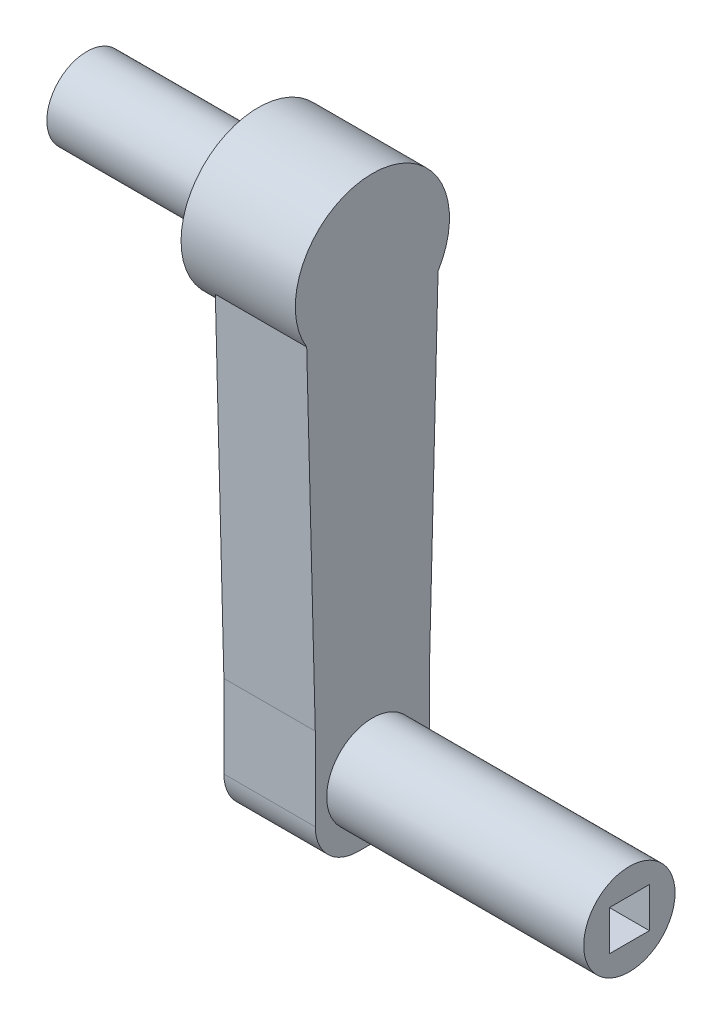
ISO-10303-21;
HEADER;
FILE_DESCRIPTION(('STEP AP214'),'2;1');
FILE_NAME('part.step','',(''),(''),'','','');
FILE_SCHEMA(('AUTOMOTIVE_DESIGN { 1 0 10303 214 1 1 1 1 }'));
ENDSEC;
DATA;
#1=APPLICATION_CONTEXT('core data for automotive mechanical design processes');
#2=APPLICATION_PROTOCOL_DEFINITION('international standard','automotive_design',2000,#1);
#3=PRODUCT_CONTEXT('',#1,'mechanical');
#4=PRODUCT('Part','Part','',(#3));
#5=PRODUCT_RELATED_PRODUCT_CATEGORY('part','',(#4));
#6=PRODUCT_DEFINITION_FORMATION('','',#4);
#7=PRODUCT_DEFINITION_CONTEXT('part definition',#1,'design');
#8=PRODUCT_DEFINITION('design','',#6,#7);
#9=PRODUCT_DEFINITION_SHAPE('','',#8);
#10=(LENGTH_UNIT() NAMED_UNIT(*) SI_UNIT(.MILLI.,.METRE.));
#11=(NAMED_UNIT(*) PLANE_ANGLE_UNIT() SI_UNIT($,.RADIAN.));
#12=(NAMED_UNIT(*) SI_UNIT($,.STERADIAN.) SOLID_ANGLE_UNIT());
#13=UNCERTAINTY_MEASURE_WITH_UNIT(LENGTH_MEASURE(1.E-05),#10,'distance_accuracy_value','');
#14=(GEOMETRIC_REPRESENTATION_CONTEXT(3) GLOBAL_UNCERTAINTY_ASSIGNED_CONTEXT((#13)) GLOBAL_UNIT_ASSIGNED_CONTEXT((#10,
#11,#12)) REPRESENTATION_CONTEXT('',''));
#15=CARTESIAN_POINT('',(0.,0.,0.));
#16=DIRECTION('',(0.,0.,1.));
#17=DIRECTION('',(1.,0.,0.));
#18=AXIS2_PLACEMENT_3D('',#15,#16,#17);
#19=CARTESIAN_POINT('',(-300.,0.,0.));
#20=DIRECTION('',(1.,0.,0.));
#21=DIRECTION('',(0.,0.,-1.));
#22=AXIS2_PLACEMENT_3D('',#19,#20,#21);
#23=CYLINDRICAL_SURFACE('',#22,70.);
#24=CARTESIAN_POINT('',(-300.,0.,0.));
#25=DIRECTION('',(1.,0.,0.));
#26=DIRECTION('',(0.,0.,-1.));
#27=AXIS2_PLACEMENT_3D('',#24,#25,#26);
#28=CIRCLE('',#27,70.);
#29=CARTESIAN_POINT('',(-300.,0.,-70.));
#30=VERTEX_POINT('',#29);
#31=EDGE_CURVE('E12',#30,#30,#28,.T.);
#32=ORIENTED_EDGE('',*,*,#31,.T.);
#33=EDGE_LOOP('',(#32));
#34=FACE_BOUND('',#33,.T.);
#35=CARTESIAN_POINT('',(0.,0.,0.));
#36=DIRECTION('',(1.,0.,0.));
#37=DIRECTION('',(0.,0.,-1.));
#38=AXIS2_PLACEMENT_3D('',#35,#36,#37);
#39=CIRCLE('',#38,70.);
#40=CARTESIAN_POINT('',(0.,0.,-70.));
#41=VERTEX_POINT('',#40);
#42=EDGE_CURVE('E85',#41,#41,#39,.T.);
#43=ORIENTED_EDGE('',*,*,#42,.F.);
#44=EDGE_LOOP('',(#43));
#45=FACE_BOUND('',#44,.T.);
#46=ADVANCED_FACE('F78',(#34,#45),#23,.T.);
#47=CARTESIAN_POINT('',(-300.,0.,0.));
#48=DIRECTION('',(1.,0.,0.));
#49=DIRECTION('',(0.,0.,-1.));
#50=AXIS2_PLACEMENT_3D('',#47,#48,#49);
#51=PLANE('',#50);
#52=ORIENTED_EDGE('',*,*,#31,.F.);
#53=EDGE_LOOP('',(#52));
#54=FACE_BOUND('',#53,.T.);
#55=ADVANCED_FACE('F91',(#54),#51,.F.);
#56=CARTESIAN_POINT('',(0.,0.,0.));
#57=DIRECTION('',(1.,0.,0.));
#58=DIRECTION('',(0.,0.,-1.));
#59=AXIS2_PLACEMENT_3D('',#56,#57,#58);
#60=PLANE('',#59);
#61=ORIENTED_EDGE('',*,*,#42,.T.);
#62=EDGE_LOOP('',(#61));
#63=FACE_BOUND('',#62,.T.);
#64=ADVANCED_FACE('F94',(#63),#60,.T.);
#65=CLOSED_SHELL('',(#46,#55,#64));
#66=MANIFOLD_SOLID_BREP('B2',#65);
#67=CARTESIAN_POINT('',(200.,-2.96751568959073,-116.722283790569));
#68=DIRECTION('',(0.,0.0254155162777915,0.999676973593137));
#69=DIRECTION('',(0.,-0.999676973593137,0.0254155162777915));
#70=AXIS2_PLACEMENT_3D('',#67,#68,#69);
#71=PLANE('',#70);
#72=DIRECTION('',(-1.,0.,0.));
#73=VECTOR('',#72,1.);
#74=CARTESIAN_POINT('',(200.,-660.710678118656,-100.));
#75=LINE('',#74,#73);
#76=CARTESIAN_POINT('',(200.,-660.710678118656,-100.));
#77=VERTEX_POINT('',#76);
#78=CARTESIAN_POINT('',(40.0000000000001,-660.710678118656,-100.));
#79=VERTEX_POINT('',#78);
#80=EDGE_CURVE('E327',#77,#79,#75,.T.);
#81=ORIENTED_EDGE('',*,*,#80,.T.);
#82=DIRECTION('',(0.,0.999676973593137,-0.0254155162777915));
#83=VECTOR('',#82,1.);
#84=CARTESIAN_POINT('',(40.,-2.96751568959073,-116.722283790569));
#85=LINE('',#84,#83);
#86=CARTESIAN_POINT('',(40.,-70.7106781186548,-115.));
#87=VERTEX_POINT('',#86);
#88=EDGE_CURVE('E350',#79,#87,#85,.T.);
#89=ORIENTED_EDGE('',*,*,#88,.T.);
#90=DIRECTION('',(-1.,0.,0.));
#91=VECTOR('',#90,1.);
#92=CARTESIAN_POINT('',(200.,-70.7106781186548,-115.));
#93=LINE('',#92,#91);
#94=CARTESIAN_POINT('',(200.,-70.7106781186548,-115.));
#95=VERTEX_POINT('',#94);
#96=EDGE_CURVE('E325',#95,#87,#93,.T.);
#97=ORIENTED_EDGE('',*,*,#96,.F.);
#98=DIRECTION('',(0.,0.999676973593137,-0.0254155162777915));
#99=VECTOR('',#98,1.);
#100=CARTESIAN_POINT('',(200.,-2.96751568959073,-116.722283790569));
#101=LINE('',#100,#99);
#102=EDGE_CURVE('E289',#77,#95,#101,.T.);
#103=ORIENTED_EDGE('',*,*,#102,.F.);
#104=EDGE_LOOP('',(#81,#89,#97,#103));
#105=FACE_BOUND('',#104,.T.);
#106=ADVANCED_FACE('F122',(#105),#71,.F.);
#107=CARTESIAN_POINT('',(200.,0.,0.));
#108=DIRECTION('',(-1.,0.,0.));
#109=DIRECTION('',(0.,0.,1.));
#110=AXIS2_PLACEMENT_3D('',#107,#108,#109);
#111=CYLINDRICAL_SURFACE('',#110,135.);
#112=CARTESIAN_POINT('',(0.,0.,0.));
#113=DIRECTION('',(1.,0.,0.));
#114=DIRECTION('',(0.,0.,-1.));
#115=AXIS2_PLACEMENT_3D('',#112,#113,#114);
#116=CIRCLE('',#115,135.);
#117=CARTESIAN_POINT('',(0.,-112.968623020499,-73.9127202371316));
#118=VERTEX_POINT('',#117);
#119=CARTESIAN_POINT('',(0.,-112.968623020499,73.9127202371314));
#120=VERTEX_POINT('',#119);
#121=EDGE_CURVE('E283',#118,#120,#116,.T.);
#122=ORIENTED_EDGE('',*,*,#121,.T.);
#123=CARTESIAN_POINT('',(-76.760000353949,0.,0.));
#124=DIRECTION('',(0.707106781186548,0.0179714839073836,-0.706878367023752));
#125=DIRECTION('',(-0.707106781186548,0.0179714839073836,-0.706878367023752));
#126=AXIS2_PLACEMENT_3D('',#123,#124,#125);
#127=ELLIPSE('',#126,190.918830920368,135.);
#128=CARTESIAN_POINT('',(40.0000000000001,-70.7106781186548,115.));
#129=VERTEX_POINT('',#128);
#130=EDGE_CURVE('E132',#120,#129,#127,.F.);
#131=ORIENTED_EDGE('',*,*,#130,.T.);
#132=DIRECTION('',(-1.,0.,0.));
#133=VECTOR('',#132,1.);
#134=CARTESIAN_POINT('',(200.,-70.7106781186548,115.));
#135=LINE('',#134,#133);
#136=CARTESIAN_POINT('',(200.,-70.7106781186548,115.));
#137=VERTEX_POINT('',#136);
#138=EDGE_CURVE('E318',#137,#129,#135,.T.);
#139=ORIENTED_EDGE('',*,*,#138,.F.);
#140=CARTESIAN_POINT('',(200.,0.,0.));
#141=DIRECTION('',(1.,0.,0.));
#142=DIRECTION('',(0.,0.,-1.));
#143=AXIS2_PLACEMENT_3D('',#140,#141,#142);
#144=CIRCLE('',#143,135.);
#145=EDGE_CURVE('E290',#95,#137,#144,.T.);
#146=ORIENTED_EDGE('',*,*,#145,.F.);
#147=ORIENTED_EDGE('',*,*,#96,.T.);
#148=CARTESIAN_POINT('',(-76.760000353949,0.,0.));
#149=DIRECTION('',(0.707106781186548,0.0179714839073834,0.706878367023752));
#150=DIRECTION('',(-0.707106781186547,0.0179714839073834,0.706878367023753));
#151=AXIS2_PLACEMENT_3D('',#148,#149,#150);
#152=ELLIPSE('',#151,190.918830920368,135.);
#153=EDGE_CURVE('E76',#87,#118,#152,.F.);
#154=ORIENTED_EDGE('',*,*,#153,.T.);
#155=EDGE_LOOP('',(#122,#131,#139,#146,#147,#154));
#156=FACE_BOUND('',#155,.T.);
#157=ADVANCED_FACE('F388',(#156),#111,.T.);
#158=CARTESIAN_POINT('',(200.,-2.96751568959076,116.722283790569));
#159=DIRECTION('',(0.,0.0254155162777917,-0.999676973593137));
#160=DIRECTION('',(0.,0.999676973593137,0.0254155162777917));
#161=AXIS2_PLACEMENT_3D('',#158,#159,#160);
#162=PLANE('',#161);
#163=ORIENTED_EDGE('',*,*,#138,.T.);
#164=DIRECTION('',(0.,-0.999676973593137,-0.0254155162777917));
#165=VECTOR('',#164,1.);
#166=CARTESIAN_POINT('',(40.0000000000001,-2.96751568959076,116.722283790569));
#167=LINE('',#166,#165);
#168=CARTESIAN_POINT('',(40.0000000000001,-660.710678118655,99.9999999999999));
#169=VERTEX_POINT('',#168);
#170=EDGE_CURVE('E329',#129,#169,#167,.T.);
#171=ORIENTED_EDGE('',*,*,#170,.T.);
#172=DIRECTION('',(-1.,0.,0.));
#173=VECTOR('',#172,1.);
#174=CARTESIAN_POINT('',(200.,-660.710678118655,99.9999999999999));
#175=LINE('',#174,#173);
#176=CARTESIAN_POINT('',(200.,-660.710678118655,99.9999999999999));
#177=VERTEX_POINT('',#176);
#178=EDGE_CURVE('E320',#177,#169,#175,.T.);
#179=ORIENTED_EDGE('',*,*,#178,.F.);
#180=DIRECTION('',(0.,-0.999676973593137,-0.0254155162777917));
#181=VECTOR('',#180,1.);
#182=CARTESIAN_POINT('',(200.,-2.96751568959076,116.722283790569));
#183=LINE('',#182,#181);
#184=EDGE_CURVE('E293',#137,#177,#183,.T.);
#185=ORIENTED_EDGE('',*,*,#184,.F.);
#186=EDGE_LOOP('',(#163,#171,#179,#185));
#187=FACE_BOUND('',#186,.T.);
#188=ADVANCED_FACE('F416',(#187),#162,.F.);
#189=CARTESIAN_POINT('',(200.,0.,99.9999999999999));
#190=DIRECTION('',(0.,0.,1.));
#191=DIRECTION('',(1.,0.,0.));
#192=AXIS2_PLACEMENT_3D('',#189,#190,#191);
#193=PLANE('',#192);
#194=ORIENTED_EDGE('',*,*,#178,.T.);
#195=DIRECTION('',(0.,-1.,0.));
#196=VECTOR('',#195,1.);
#197=CARTESIAN_POINT('',(40.0000000000001,-805.710678118655,99.9999999999999));
#198=LINE('',#197,#196);
#199=CARTESIAN_POINT('',(40.0000000000001,-805.710678118655,99.9999999999999));
#200=VERTEX_POINT('',#199);
#201=EDGE_CURVE('E353',#169,#200,#198,.T.);
#202=ORIENTED_EDGE('',*,*,#201,.T.);
#203=DIRECTION('',(-1.,0.,0.));
#204=VECTOR('',#203,1.);
#205=CARTESIAN_POINT('',(200.,-805.710678118655,99.9999999999999));
#206=LINE('',#205,#204);
#207=CARTESIAN_POINT('',(200.,-805.710678118655,99.9999999999999));
#208=VERTEX_POINT('',#207);
#209=EDGE_CURVE('E314',#208,#200,#206,.T.);
#210=ORIENTED_EDGE('',*,*,#209,.F.);
#211=DIRECTION('',(0.,1.,0.));
#212=VECTOR('',#211,1.);
#213=CARTESIAN_POINT('',(200.,0.,99.9999999999999));
#214=LINE('',#213,#212);
#215=EDGE_CURVE('E291',#208,#177,#214,.T.);
#216=ORIENTED_EDGE('',*,*,#215,.T.);
#217=EDGE_LOOP('',(#194,#202,#210,#216));
#218=FACE_BOUND('',#217,.T.);
#219=ADVANCED_FACE('F426',(#218),#193,.T.);
#220=CARTESIAN_POINT('',(200.,-805.710678118655,25.));
#221=DIRECTION('',(-1.,0.,0.));
#222=DIRECTION('',(0.,0.,1.));
#223=AXIS2_PLACEMENT_3D('',#220,#221,#222);
#224=CYLINDRICAL_SURFACE('',#223,75.);
#225=ORIENTED_EDGE('',*,*,#209,.T.);
#226=CARTESIAN_POINT('',(40.0000000000001,-805.710678118655,25.));
#227=DIRECTION('',(1.,0.,0.));
#228=DIRECTION('',(0.,0.,-1.));
#229=AXIS2_PLACEMENT_3D('',#226,#227,#228);
#230=CIRCLE('',#229,75.);
#231=CARTESIAN_POINT('',(40.0000000000001,-880.710678118655,24.9999999999999));
#232=VERTEX_POINT('',#231);
#233=EDGE_CURVE('E140',#200,#232,#230,.T.);
#234=ORIENTED_EDGE('',*,*,#233,.T.);
#235=DIRECTION('',(-1.,0.,0.));
#236=VECTOR('',#235,1.);
#237=CARTESIAN_POINT('',(200.,-880.710678118655,24.9999999999999));
#238=LINE('',#237,#236);
#239=CARTESIAN_POINT('',(200.,-880.710678118655,24.9999999999999));
#240=VERTEX_POINT('',#239);
#241=EDGE_CURVE('E312',#240,#232,#238,.T.);
#242=ORIENTED_EDGE('',*,*,#241,.F.);
#243=CARTESIAN_POINT('',(200.,-805.710678118655,25.));
#244=DIRECTION('',(1.,0.,0.));
#245=DIRECTION('',(0.,0.,-1.));
#246=AXIS2_PLACEMENT_3D('',#243,#244,#245);
#247=CIRCLE('',#246,75.);
#248=EDGE_CURVE('E298',#240,#208,#247,.F.);
#249=ORIENTED_EDGE('',*,*,#248,.T.);
#250=EDGE_LOOP('',(#225,#234,#242,#249));
#251=FACE_BOUND('',#250,.T.);
#252=ADVANCED_FACE('F429',(#251),#224,.T.);
#253=CARTESIAN_POINT('',(200.,-880.710678118655,0.));
#254=DIRECTION('',(0.,-1.,0.));
#255=DIRECTION('',(0.,0.,-1.));
#256=AXIS2_PLACEMENT_3D('',#253,#254,#255);
#257=PLANE('',#256);
#258=ORIENTED_EDGE('',*,*,#241,.T.);
#259=DIRECTION('',(0.,0.,-1.));
#260=VECTOR('',#259,1.);
#261=CARTESIAN_POINT('',(40.0000000000001,-880.710678118655,-25.0000000000001));
#262=LINE('',#261,#260);
#263=CARTESIAN_POINT('',(40.0000000000001,-880.710678118655,-25.0000000000001));
#264=VERTEX_POINT('',#263);
#265=EDGE_CURVE('E149',#232,#264,#262,.T.);
#266=ORIENTED_EDGE('',*,*,#265,.T.);
#267=DIRECTION('',(-1.,0.,0.));
#268=VECTOR('',#267,1.);
#269=CARTESIAN_POINT('',(200.,-880.710678118655,-25.0000000000001));
#270=LINE('',#269,#268);
#271=CARTESIAN_POINT('',(200.,-880.710678118655,-25.0000000000001));
#272=VERTEX_POINT('',#271);
#273=EDGE_CURVE('E311',#272,#264,#270,.T.);
#274=ORIENTED_EDGE('',*,*,#273,.F.);
#275=DIRECTION('',(0.,0.,1.));
#276=VECTOR('',#275,1.);
#277=CARTESIAN_POINT('',(200.,-880.710678118655,0.));
#278=LINE('',#277,#276);
#279=EDGE_CURVE('E299',#272,#240,#278,.T.);
#280=ORIENTED_EDGE('',*,*,#279,.T.);
#281=EDGE_LOOP('',(#258,#266,#274,#280));
#282=FACE_BOUND('',#281,.T.);
#283=ADVANCED_FACE('F512',(#282),#257,.T.);
#284=CARTESIAN_POINT('',(200.,-805.710678118655,-25.0000000000001));
#285=DIRECTION('',(-1.,0.,0.));
#286=DIRECTION('',(0.,0.,1.));
#287=AXIS2_PLACEMENT_3D('',#284,#285,#286);
#288=CYLINDRICAL_SURFACE('',#287,75.);
#289=ORIENTED_EDGE('',*,*,#273,.T.);
#290=CARTESIAN_POINT('',(40.0000000000001,-805.710678118655,-25.0000000000001));
#291=DIRECTION('',(1.,0.,0.));
#292=DIRECTION('',(0.,0.,-1.));
#293=AXIS2_PLACEMENT_3D('',#290,#291,#292);
#294=CIRCLE('',#293,75.);
#295=CARTESIAN_POINT('',(40.0000000000001,-805.710678118655,-100.));
#296=VERTEX_POINT('',#295);
#297=EDGE_CURVE('E352',#264,#296,#294,.T.);
#298=ORIENTED_EDGE('',*,*,#297,.T.);
#299=DIRECTION('',(-1.,0.,0.));
#300=VECTOR('',#299,1.);
#301=CARTESIAN_POINT('',(200.,-805.710678118655,-100.));
#302=LINE('',#301,#300);
#303=CARTESIAN_POINT('',(200.,-805.710678118655,-100.));
#304=VERTEX_POINT('',#303);
#305=EDGE_CURVE('E310',#304,#296,#302,.T.);
#306=ORIENTED_EDGE('',*,*,#305,.F.);
#307=CARTESIAN_POINT('',(200.,-805.710678118655,-25.0000000000001));
#308=DIRECTION('',(1.,0.,0.));
#309=DIRECTION('',(0.,0.,-1.));
#310=AXIS2_PLACEMENT_3D('',#307,#308,#309);
#311=CIRCLE('',#310,75.);
#312=EDGE_CURVE('E305',#272,#304,#311,.T.);
#313=ORIENTED_EDGE('',*,*,#312,.F.);
#314=EDGE_LOOP('',(#289,#298,#306,#313));
#315=FACE_BOUND('',#314,.T.);
#316=ADVANCED_FACE('F404',(#315),#288,.T.);
#317=CARTESIAN_POINT('',(200.,0.,-100.));
#318=DIRECTION('',(0.,0.,1.));
#319=DIRECTION('',(1.,0.,0.));
#320=AXIS2_PLACEMENT_3D('',#317,#318,#319);
#321=PLANE('',#320);
#322=ORIENTED_EDGE('',*,*,#305,.T.);
#323=DIRECTION('',(0.,1.,0.));
#324=VECTOR('',#323,1.);
#325=CARTESIAN_POINT('',(40.0000000000001,0.,-100.));
#326=LINE('',#325,#324);
#327=EDGE_CURVE('E349',#296,#79,#326,.T.);
#328=ORIENTED_EDGE('',*,*,#327,.T.);
#329=ORIENTED_EDGE('',*,*,#80,.F.);
#330=DIRECTION('',(0.,1.,0.));
#331=VECTOR('',#330,1.);
#332=CARTESIAN_POINT('',(200.,0.,-100.));
#333=LINE('',#332,#331);
#334=EDGE_CURVE('E284',#304,#77,#333,.T.);
#335=ORIENTED_EDGE('',*,*,#334,.F.);
#336=EDGE_LOOP('',(#322,#328,#329,#335));
#337=FACE_BOUND('',#336,.T.);
#338=ADVANCED_FACE('F405',(#337),#321,.F.);
#339=CARTESIAN_POINT('',(0.,0.,0.));
#340=DIRECTION('',(1.,0.,0.));
#341=DIRECTION('',(0.,0.,-1.));
#342=AXIS2_PLACEMENT_3D('',#339,#340,#341);
#343=PLANE('',#342);
#344=DIRECTION('',(0.,0.999676973593137,0.0254155162777917));
#345=VECTOR('',#344,1.);
#346=CARTESIAN_POINT('',(0.,-1.95089503847909,76.7352048468438));
#347=LINE('',#346,#345);
#348=CARTESIAN_POINT('',(0.,-660.202285681003,59.9999999999999));
#349=VERTEX_POINT('',#348);
#350=EDGE_CURVE('E343',#349,#120,#347,.T.);
#351=ORIENTED_EDGE('',*,*,#350,.T.);
#352=ORIENTED_EDGE('',*,*,#121,.F.);
#353=DIRECTION('',(0.,-0.999676973593137,0.0254155162777915));
#354=VECTOR('',#353,1.);
#355=CARTESIAN_POINT('',(0.,-1.95089503847907,-76.7352048468439));
#356=LINE('',#355,#354);
#357=CARTESIAN_POINT('',(0.,-660.202285681009,-60.));
#358=VERTEX_POINT('',#357);
#359=EDGE_CURVE('E341',#118,#358,#356,.T.);
#360=ORIENTED_EDGE('',*,*,#359,.T.);
#361=DIRECTION('',(0.,-1.,0.));
#362=VECTOR('',#361,1.);
#363=CARTESIAN_POINT('',(0.,0.,-60.));
#364=LINE('',#363,#362);
#365=CARTESIAN_POINT('',(0.,-805.710678118655,-60.));
#366=VERTEX_POINT('',#365);
#367=EDGE_CURVE('E338',#358,#366,#364,.T.);
#368=ORIENTED_EDGE('',*,*,#367,.T.);
#369=CARTESIAN_POINT('',(0.,-805.710678118655,-25.0000000000001));
#370=DIRECTION('',(1.,0.,0.));
#371=DIRECTION('',(0.,0.,-1.));
#372=AXIS2_PLACEMENT_3D('',#369,#370,#371);
#373=CIRCLE('',#372,34.9999999999999);
#374=CARTESIAN_POINT('',(0.,-840.710678118655,-25.0000000000001));
#375=VERTEX_POINT('',#374);
#376=EDGE_CURVE('E337',#366,#375,#373,.F.);
#377=ORIENTED_EDGE('',*,*,#376,.T.);
#378=DIRECTION('',(0.,0.,1.));
#379=VECTOR('',#378,1.);
#380=CARTESIAN_POINT('',(0.,-840.710678118655,24.9999999999999));
#381=LINE('',#380,#379);
#382=CARTESIAN_POINT('',(0.,-840.710678118655,25.));
#383=VERTEX_POINT('',#382);
#384=EDGE_CURVE('E334',#375,#383,#381,.T.);
#385=ORIENTED_EDGE('',*,*,#384,.T.);
#386=CARTESIAN_POINT('',(0.,-805.710678118655,25.));
#387=DIRECTION('',(1.,0.,0.));
#388=DIRECTION('',(0.,0.,-1.));
#389=AXIS2_PLACEMENT_3D('',#386,#387,#388);
#390=CIRCLE('',#389,35.);
#391=CARTESIAN_POINT('',(0.,-805.710678118655,59.9999999999999));
#392=VERTEX_POINT('',#391);
#393=EDGE_CURVE('E335',#383,#392,#390,.F.);
#394=ORIENTED_EDGE('',*,*,#393,.T.);
#395=DIRECTION('',(0.,1.,0.));
#396=VECTOR('',#395,1.);
#397=CARTESIAN_POINT('',(0.,-660.710678118655,59.9999999999999));
#398=LINE('',#397,#396);
#399=EDGE_CURVE('E336',#392,#349,#398,.T.);
#400=ORIENTED_EDGE('',*,*,#399,.T.);
#401=EDGE_LOOP('',(#351,#352,#360,#368,#377,#385,#394,#400));
#402=FACE_BOUND('',#401,.T.);
#403=ADVANCED_FACE('F413',(#402),#343,.F.);
#404=CARTESIAN_POINT('',(200.,0.,0.));
#405=DIRECTION('',(1.,0.,0.));
#406=DIRECTION('',(0.,0.,-1.));
#407=AXIS2_PLACEMENT_3D('',#404,#405,#406);
#408=PLANE('',#407);
#409=ORIENTED_EDGE('',*,*,#334,.T.);
#410=ORIENTED_EDGE('',*,*,#102,.T.);
#411=ORIENTED_EDGE('',*,*,#145,.T.);
#412=ORIENTED_EDGE('',*,*,#184,.T.);
#413=ORIENTED_EDGE('',*,*,#215,.F.);
#414=ORIENTED_EDGE('',*,*,#248,.F.);
#415=ORIENTED_EDGE('',*,*,#279,.F.);
#416=ORIENTED_EDGE('',*,*,#312,.T.);
#417=EDGE_LOOP('',(#409,#410,#411,#412,#413,#414,#415,#416));
#418=FACE_BOUND('',#417,.T.);
#419=CARTESIAN_POINT('',(200.,-770.710678118655,0.));
#420=DIRECTION('',(1.,0.,0.));
#421=DIRECTION('',(0.,0.,-1.));
#422=AXIS2_PLACEMENT_3D('',#419,#420,#421);
#423=CIRCLE('',#422,80.0000000000001);
#424=CARTESIAN_POINT('',(200.,-770.710678118655,-80.0000000000002));
#425=VERTEX_POINT('',#424);
#426=EDGE_CURVE('E302',#425,#425,#423,.T.);
#427=ORIENTED_EDGE('',*,*,#426,.F.);
#428=EDGE_LOOP('',(#427));
#429=FACE_BOUND('',#428,.T.);
#430=ADVANCED_FACE('F393',(#418,#429),#408,.T.);
#431=CARTESIAN_POINT('',(650.,0.,0.));
#432=DIRECTION('',(1.,0.,0.));
#433=DIRECTION('',(0.,0.,-1.));
#434=AXIS2_PLACEMENT_3D('',#431,#432,#433);
#435=PLANE('',#434);
#436=DIRECTION('',(0.,1.,0.));
#437=VECTOR('',#436,1.);
#438=CARTESIAN_POINT('',(650.,-805.710678118655,-35.0000000000001));
#439=LINE('',#438,#437);
#440=CARTESIAN_POINT('',(650.,-805.710678118655,-35.0000000000001));
#441=VERTEX_POINT('',#440);
#442=CARTESIAN_POINT('',(650.,-735.710678118655,-35.0000000000001));
#443=VERTEX_POINT('',#442);
#444=EDGE_CURVE('E244',#441,#443,#439,.T.);
#445=ORIENTED_EDGE('',*,*,#444,.F.);
#446=DIRECTION('',(0.,0.,-1.));
#447=VECTOR('',#446,1.);
#448=CARTESIAN_POINT('',(650.,-805.710678118655,34.9999999999999));
#449=LINE('',#448,#447);
#450=CARTESIAN_POINT('',(650.,-805.710678118655,34.9999999999999));
#451=VERTEX_POINT('',#450);
#452=EDGE_CURVE('E265',#451,#441,#449,.T.);
#453=ORIENTED_EDGE('',*,*,#452,.F.);
#454=DIRECTION('',(0.,-1.,0.));
#455=VECTOR('',#454,1.);
#456=CARTESIAN_POINT('',(650.,-805.710678118655,34.9999999999999));
#457=LINE('',#456,#455);
#458=CARTESIAN_POINT('',(650.,-735.710678118655,34.9999999999999));
#459=VERTEX_POINT('',#458);
#460=EDGE_CURVE('E261',#459,#451,#457,.T.);
#461=ORIENTED_EDGE('',*,*,#460,.F.);
#462=DIRECTION('',(0.,0.,1.));
#463=VECTOR('',#462,1.);
#464=CARTESIAN_POINT('',(650.,-735.710678118655,34.9999999999999));
#465=LINE('',#464,#463);
#466=EDGE_CURVE('E272',#443,#459,#465,.T.);
#467=ORIENTED_EDGE('',*,*,#466,.F.);
#468=EDGE_LOOP('',(#445,#453,#461,#467));
#469=FACE_BOUND('',#468,.T.);
#470=CARTESIAN_POINT('',(650.,-770.710678118655,0.));
#471=DIRECTION('',(1.,0.,0.));
#472=DIRECTION('',(0.,0.,-1.));
#473=AXIS2_PLACEMENT_3D('',#470,#471,#472);
#474=CIRCLE('',#473,80.0000000000001);
#475=CARTESIAN_POINT('',(650.,-770.710678118655,-80.0000000000002));
#476=VERTEX_POINT('',#475);
#477=EDGE_CURVE('E276',#476,#476,#474,.T.);
#478=ORIENTED_EDGE('',*,*,#477,.T.);
#479=EDGE_LOOP('',(#478));
#480=FACE_BOUND('',#479,.T.);
#481=ADVANCED_FACE('F497',(#469,#480),#435,.T.);
#482=CARTESIAN_POINT('',(650.,-770.710678118655,0.));
#483=DIRECTION('',(-1.,0.,0.));
#484=DIRECTION('',(0.,0.,1.));
#485=AXIS2_PLACEMENT_3D('',#482,#483,#484);
#486=CYLINDRICAL_SURFACE('',#485,80.0000000000001);
#487=ORIENTED_EDGE('',*,*,#426,.T.);
#488=EDGE_LOOP('',(#487));
#489=FACE_BOUND('',#488,.T.);
#490=ORIENTED_EDGE('',*,*,#477,.F.);
#491=EDGE_LOOP('',(#490));
#492=FACE_BOUND('',#491,.T.);
#493=ADVANCED_FACE('F498',(#489,#492),#486,.T.);
#494=CARTESIAN_POINT('',(550.,-805.710678118655,-35.0000000000001));
#495=DIRECTION('',(0.,0.,-1.));
#496=DIRECTION('',(-1.,0.,0.));
#497=AXIS2_PLACEMENT_3D('',#494,#495,#496);
#498=PLANE('',#497);
#499=ORIENTED_EDGE('',*,*,#444,.T.);
#500=DIRECTION('',(1.,0.,0.));
#501=VECTOR('',#500,1.);
#502=CARTESIAN_POINT('',(550.,-735.710678118655,-35.0000000000001));
#503=LINE('',#502,#501);
#504=CARTESIAN_POINT('',(550.,-735.710678118655,-35.0000000000001));
#505=VERTEX_POINT('',#504);
#506=EDGE_CURVE('E238',#505,#443,#503,.T.);
#507=ORIENTED_EDGE('',*,*,#506,.F.);
#508=DIRECTION('',(0.,1.,0.));
#509=VECTOR('',#508,1.);
#510=CARTESIAN_POINT('',(550.,-805.710678118655,-35.0000000000001));
#511=LINE('',#510,#509);
#512=CARTESIAN_POINT('',(550.,-805.710678118655,-35.0000000000001));
#513=VERTEX_POINT('',#512);
#514=EDGE_CURVE('E245',#513,#505,#511,.T.);
#515=ORIENTED_EDGE('',*,*,#514,.F.);
#516=DIRECTION('',(1.,0.,0.));
#517=VECTOR('',#516,1.);
#518=CARTESIAN_POINT('',(550.,-805.710678118655,-35.0000000000001));
#519=LINE('',#518,#517);
#520=EDGE_CURVE('E273',#513,#441,#519,.T.);
#521=ORIENTED_EDGE('',*,*,#520,.T.);
#522=EDGE_LOOP('',(#499,#507,#515,#521));
#523=FACE_BOUND('',#522,.T.);
#524=ADVANCED_FACE('F239',(#523),#498,.F.);
#525=CARTESIAN_POINT('',(550.,-805.710678118655,34.9999999999999));
#526=DIRECTION('',(0.,-1.,0.));
#527=DIRECTION('',(0.,0.,-1.));
#528=AXIS2_PLACEMENT_3D('',#525,#526,#527);
#529=PLANE('',#528);
#530=ORIENTED_EDGE('',*,*,#452,.T.);
#531=ORIENTED_EDGE('',*,*,#520,.F.);
#532=DIRECTION('',(0.,0.,-1.));
#533=VECTOR('',#532,1.);
#534=CARTESIAN_POINT('',(550.,-805.710678118655,34.9999999999999));
#535=LINE('',#534,#533);
#536=CARTESIAN_POINT('',(550.,-805.710678118655,34.9999999999999));
#537=VERTEX_POINT('',#536);
#538=EDGE_CURVE('E249',#537,#513,#535,.T.);
#539=ORIENTED_EDGE('',*,*,#538,.F.);
#540=DIRECTION('',(1.,0.,0.));
#541=VECTOR('',#540,1.);
#542=CARTESIAN_POINT('',(550.,-805.710678118655,34.9999999999999));
#543=LINE('',#542,#541);
#544=EDGE_CURVE('E280',#537,#451,#543,.T.);
#545=ORIENTED_EDGE('',*,*,#544,.T.);
#546=EDGE_LOOP('',(#530,#531,#539,#545));
#547=FACE_BOUND('',#546,.T.);
#548=ADVANCED_FACE('F490',(#547),#529,.F.);
#549=CARTESIAN_POINT('',(550.,-805.710678118655,34.9999999999999));
#550=DIRECTION('',(0.,0.,1.));
#551=DIRECTION('',(1.,0.,0.));
#552=AXIS2_PLACEMENT_3D('',#549,#550,#551);
#553=PLANE('',#552);
#554=ORIENTED_EDGE('',*,*,#460,.T.);
#555=ORIENTED_EDGE('',*,*,#544,.F.);
#556=DIRECTION('',(0.,-1.,0.));
#557=VECTOR('',#556,1.);
#558=CARTESIAN_POINT('',(550.,-805.710678118655,34.9999999999999));
#559=LINE('',#558,#557);
#560=CARTESIAN_POINT('',(550.,-735.710678118655,34.9999999999999));
#561=VERTEX_POINT('',#560);
#562=EDGE_CURVE('E260',#561,#537,#559,.T.);
#563=ORIENTED_EDGE('',*,*,#562,.F.);
#564=DIRECTION('',(1.,0.,0.));
#565=VECTOR('',#564,1.);
#566=CARTESIAN_POINT('',(550.,-735.710678118655,34.9999999999999));
#567=LINE('',#566,#565);
#568=EDGE_CURVE('E248',#561,#459,#567,.T.);
#569=ORIENTED_EDGE('',*,*,#568,.T.);
#570=EDGE_LOOP('',(#554,#555,#563,#569));
#571=FACE_BOUND('',#570,.T.);
#572=ADVANCED_FACE('F488',(#571),#553,.F.);
#573=CARTESIAN_POINT('',(550.,-735.710678118655,34.9999999999999));
#574=DIRECTION('',(0.,1.,0.));
#575=DIRECTION('',(0.,0.,1.));
#576=AXIS2_PLACEMENT_3D('',#573,#574,#575);
#577=PLANE('',#576);
#578=ORIENTED_EDGE('',*,*,#466,.T.);
#579=ORIENTED_EDGE('',*,*,#568,.F.);
#580=DIRECTION('',(0.,0.,1.));
#581=VECTOR('',#580,1.);
#582=CARTESIAN_POINT('',(550.,-735.710678118655,34.9999999999999));
#583=LINE('',#582,#581);
#584=EDGE_CURVE('E254',#505,#561,#583,.T.);
#585=ORIENTED_EDGE('',*,*,#584,.F.);
#586=ORIENTED_EDGE('',*,*,#506,.T.);
#587=EDGE_LOOP('',(#578,#579,#585,#586));
#588=FACE_BOUND('',#587,.T.);
#589=ADVANCED_FACE('F251',(#588),#577,.F.);
#590=CARTESIAN_POINT('',(550.,0.,0.));
#591=DIRECTION('',(-1.,0.,0.));
#592=DIRECTION('',(0.,0.,1.));
#593=AXIS2_PLACEMENT_3D('',#590,#591,#592);
#594=PLANE('',#593);
#595=ORIENTED_EDGE('',*,*,#514,.T.);
#596=ORIENTED_EDGE('',*,*,#584,.T.);
#597=ORIENTED_EDGE('',*,*,#562,.T.);
#598=ORIENTED_EDGE('',*,*,#538,.T.);
#599=EDGE_LOOP('',(#595,#596,#597,#598));
#600=FACE_BOUND('',#599,.T.);
#601=ADVANCED_FACE('F257',(#600),#594,.F.);
#602=CARTESIAN_POINT('',(40.,-2.96751568959073,-116.722283790569));
#603=DIRECTION('',(0.707106781186548,0.0179714839073834,0.706878367023752));
#604=DIRECTION('',(0.,0.999676973593137,-0.0254155162777915));
#605=AXIS2_PLACEMENT_3D('',#602,#603,#604);
#606=PLANE('',#605);
#607=ORIENTED_EDGE('',*,*,#153,.F.);
#608=ORIENTED_EDGE('',*,*,#88,.F.);
#609=DIRECTION('',(0.707078226533716,-0.00898683057995798,-0.707078226533714));
#610=VECTOR('',#609,1.);
#611=CARTESIAN_POINT('',(44.1809085835687,-660.763816676321,-104.180908583569));
#612=LINE('',#611,#610);
#613=EDGE_CURVE('E129',#358,#79,#612,.T.);
#614=ORIENTED_EDGE('',*,*,#613,.F.);
#615=ORIENTED_EDGE('',*,*,#359,.F.);
#616=EDGE_LOOP('',(#607,#608,#614,#615));
#617=FACE_BOUND('',#616,.T.);
#618=ADVANCED_FACE('F121',(#617),#606,.F.);
#619=CARTESIAN_POINT('',(40.0000000000001,0.,-100.));
#620=DIRECTION('',(0.707106781186547,0.,0.707106781186549));
#621=DIRECTION('',(0.,1.,0.));
#622=AXIS2_PLACEMENT_3D('',#619,#620,#621);
#623=PLANE('',#622);
#624=ORIENTED_EDGE('',*,*,#613,.T.);
#625=ORIENTED_EDGE('',*,*,#327,.F.);
#626=DIRECTION('',(0.707106781186549,0.,-0.707106781186547));
#627=VECTOR('',#626,1.);
#628=CARTESIAN_POINT('',(0.,-805.710678118655,-60.));
#629=LINE('',#628,#627);
#630=EDGE_CURVE('E368',#366,#296,#629,.T.);
#631=ORIENTED_EDGE('',*,*,#630,.F.);
#632=ORIENTED_EDGE('',*,*,#367,.F.);
#633=EDGE_LOOP('',(#624,#625,#631,#632));
#634=FACE_BOUND('',#633,.T.);
#635=ADVANCED_FACE('F378',(#634),#623,.F.);
#636=CARTESIAN_POINT('',(40.0000000000001,-805.710678118655,-25.0000000000001));
#637=DIRECTION('',(1.,0.,0.));
#638=DIRECTION('',(0.,0.,-1.));
#639=AXIS2_PLACEMENT_3D('',#636,#637,#638);
#640=CONICAL_SURFACE('',#639,75.,0.785398163397447);
#641=ORIENTED_EDGE('',*,*,#630,.T.);
#642=ORIENTED_EDGE('',*,*,#297,.F.);
#643=DIRECTION('',(0.707106781186549,-0.707106781186547,0.));
#644=VECTOR('',#643,1.);
#645=CARTESIAN_POINT('',(0.,-840.710678118655,-25.0000000000001));
#646=LINE('',#645,#644);
#647=EDGE_CURVE('E366',#375,#264,#646,.T.);
#648=ORIENTED_EDGE('',*,*,#647,.F.);
#649=ORIENTED_EDGE('',*,*,#376,.F.);
#650=EDGE_LOOP('',(#641,#642,#648,#649));
#651=FACE_BOUND('',#650,.T.);
#652=ADVANCED_FACE('F409',(#651),#640,.T.);
#653=CARTESIAN_POINT('',(0.,-840.710678118655,0.));
#654=DIRECTION('',(-0.707106781186547,-0.707106781186549,0.));
#655=DIRECTION('',(0.,0.,-1.));
#656=AXIS2_PLACEMENT_3D('',#653,#654,#655);
#657=PLANE('',#656);
#658=ORIENTED_EDGE('',*,*,#647,.T.);
#659=ORIENTED_EDGE('',*,*,#265,.F.);
#660=DIRECTION('',(0.707106781186549,-0.707106781186547,0.));
#661=VECTOR('',#660,1.);
#662=CARTESIAN_POINT('',(0.,-840.710678118655,25.));
#663=LINE('',#662,#661);
#664=EDGE_CURVE('E361',#383,#232,#663,.T.);
#665=ORIENTED_EDGE('',*,*,#664,.F.);
#666=ORIENTED_EDGE('',*,*,#384,.F.);
#667=EDGE_LOOP('',(#658,#659,#665,#666));
#668=FACE_BOUND('',#667,.T.);
#669=ADVANCED_FACE('F408',(#668),#657,.T.);
#670=CARTESIAN_POINT('',(0.,-805.710678118655,25.));
#671=DIRECTION('',(1.,0.,0.));
#672=DIRECTION('',(0.,0.,-1.));
#673=AXIS2_PLACEMENT_3D('',#670,#671,#672);
#674=CONICAL_SURFACE('',#673,35.,0.785398163397447);
#675=ORIENTED_EDGE('',*,*,#664,.T.);
#676=ORIENTED_EDGE('',*,*,#233,.F.);
#677=DIRECTION('',(0.707106781186549,0.,0.707106781186547));
#678=VECTOR('',#677,1.);
#679=CARTESIAN_POINT('',(0.,-805.710678118655,59.9999999999999));
#680=LINE('',#679,#678);
#681=EDGE_CURVE('E359',#392,#200,#680,.T.);
#682=ORIENTED_EDGE('',*,*,#681,.F.);
#683=ORIENTED_EDGE('',*,*,#393,.F.);
#684=EDGE_LOOP('',(#675,#676,#682,#683));
#685=FACE_BOUND('',#684,.T.);
#686=ADVANCED_FACE('F435',(#685),#674,.T.);
#687=CARTESIAN_POINT('',(0.,0.,59.9999999999999));
#688=DIRECTION('',(-0.707106781186547,0.,0.707106781186549));
#689=DIRECTION('',(0.,-1.,0.));
#690=AXIS2_PLACEMENT_3D('',#687,#688,#689);
#691=PLANE('',#690);
#692=ORIENTED_EDGE('',*,*,#681,.T.);
#693=ORIENTED_EDGE('',*,*,#201,.F.);
#694=DIRECTION('',(0.707078226533716,-0.00898683057994554,0.707078226533714));
#695=VECTOR('',#694,1.);
#696=CARTESIAN_POINT('',(44.1809085835746,-660.763816676315,104.180908583574));
#697=LINE('',#696,#695);
#698=EDGE_CURVE('E356',#349,#169,#697,.T.);
#699=ORIENTED_EDGE('',*,*,#698,.F.);
#700=ORIENTED_EDGE('',*,*,#399,.F.);
#701=EDGE_LOOP('',(#692,#693,#699,#700));
#702=FACE_BOUND('',#701,.T.);
#703=ADVANCED_FACE('F428',(#702),#691,.T.);
#704=CARTESIAN_POINT('',(40.0000000000001,-2.96751568959076,116.722283790569));
#705=DIRECTION('',(0.707106781186548,0.0179714839073836,-0.706878367023752));
#706=DIRECTION('',(0.,-0.999676973593137,-0.0254155162777917));
#707=AXIS2_PLACEMENT_3D('',#704,#705,#706);
#708=PLANE('',#707);
#709=ORIENTED_EDGE('',*,*,#130,.F.);
#710=ORIENTED_EDGE('',*,*,#350,.F.);
#711=ORIENTED_EDGE('',*,*,#698,.T.);
#712=ORIENTED_EDGE('',*,*,#170,.F.);
#713=EDGE_LOOP('',(#709,#710,#711,#712));
#714=FACE_BOUND('',#713,.T.);
#715=ADVANCED_FACE('F423',(#714),#708,.F.);
#716=CLOSED_SHELL('',(#106,#157,#188,#219,#252,#283,#316,#338,#403,#430,#481,#493,#524,#548,
#572,#589,#601,#618,#635,#652,#669,#686,#703,#715));
#717=MANIFOLD_SOLID_BREP('B7',#716);
#718=ADVANCED_BREP_SHAPE_REPRESENTATION('',(#18,#66,#717),#14);
#719=SHAPE_DEFINITION_REPRESENTATION(#9,#718);
ENDSEC;
END-ISO-10303-21;
